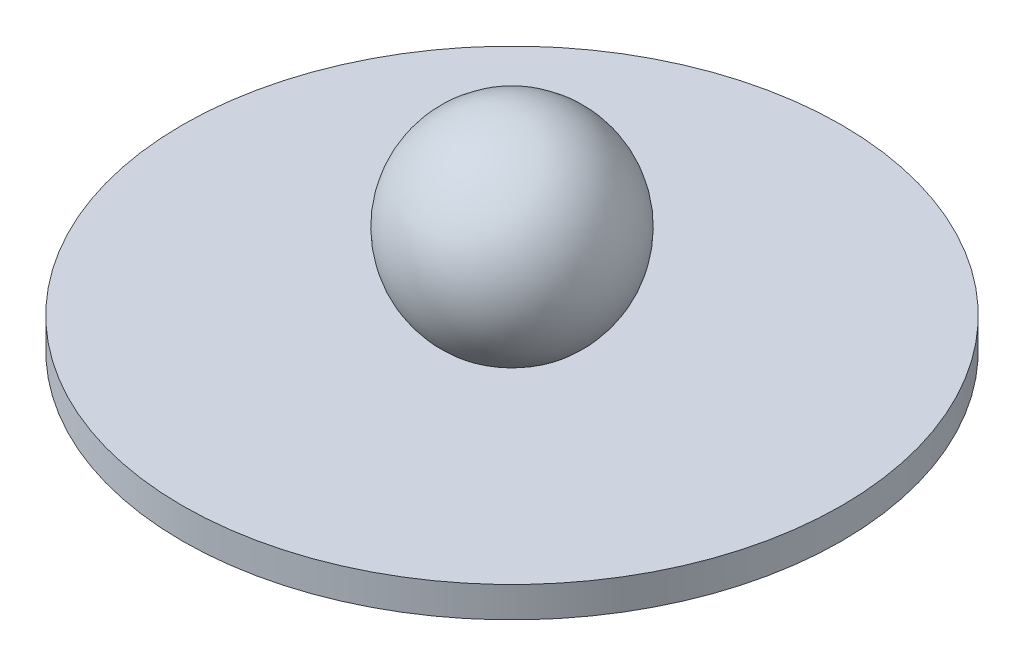
ISO-10303-21;
HEADER;
FILE_DESCRIPTION(('STEP AP214'),'2;1');
FILE_NAME('part.step','',(''),(''),'','','');
FILE_SCHEMA(('AUTOMOTIVE_DESIGN { 1 0 10303 214 1 1 1 1 }'));
ENDSEC;
DATA;
#1=APPLICATION_CONTEXT('core data for automotive mechanical design processes');
#2=APPLICATION_PROTOCOL_DEFINITION('international standard','automotive_design',2000,#1);
#3=PRODUCT_CONTEXT('',#1,'mechanical');
#4=PRODUCT('Part','Part','',(#3));
#5=PRODUCT_RELATED_PRODUCT_CATEGORY('part','',(#4));
#6=PRODUCT_DEFINITION_FORMATION('','',#4);
#7=PRODUCT_DEFINITION_CONTEXT('part definition',#1,'design');
#8=PRODUCT_DEFINITION('design','',#6,#7);
#9=PRODUCT_DEFINITION_SHAPE('','',#8);
#10=(LENGTH_UNIT() NAMED_UNIT(*) SI_UNIT(.MILLI.,.METRE.));
#11=(NAMED_UNIT(*) PLANE_ANGLE_UNIT() SI_UNIT($,.RADIAN.));
#12=(NAMED_UNIT(*) SI_UNIT($,.STERADIAN.) SOLID_ANGLE_UNIT());
#13=UNCERTAINTY_MEASURE_WITH_UNIT(LENGTH_MEASURE(1.E-05),#10,'distance_accuracy_value','');
#14=(GEOMETRIC_REPRESENTATION_CONTEXT(3) GLOBAL_UNCERTAINTY_ASSIGNED_CONTEXT((#13)) GLOBAL_UNIT_ASSIGNED_CONTEXT((#10,
#11,#12)) REPRESENTATION_CONTEXT('',''));
#15=CARTESIAN_POINT('',(0.,0.,0.));
#16=DIRECTION('',(0.,0.,1.));
#17=DIRECTION('',(1.,0.,0.));
#18=AXIS2_PLACEMENT_3D('',#15,#16,#17);
#19=CARTESIAN_POINT('',(0.,12.7,0.));
#20=DIRECTION('',(0.,1.,0.));
#21=DIRECTION('',(0.,0.,1.));
#22=AXIS2_PLACEMENT_3D('',#19,#20,#21);
#23=PLANE('',#22);
#24=CARTESIAN_POINT('',(0.,12.7,0.));
#25=DIRECTION('',(0.,1.,0.));
#26=DIRECTION('',(0.,0.,1.));
#27=AXIS2_PLACEMENT_3D('',#24,#25,#26);
#28=CIRCLE('',#27,12.2794054520389);
#29=CARTESIAN_POINT('',(0.,12.7,12.2794054520389));
#30=VERTEX_POINT('',#29);
#31=EDGE_CURVE('E10',#30,#30,#28,.T.);
#32=ORIENTED_EDGE('',*,*,#31,.F.);
#33=EDGE_LOOP('',(#32));
#34=FACE_BOUND('',#33,.T.);
#35=CARTESIAN_POINT('',(0.,12.7,0.));
#36=DIRECTION('',(0.,-1.,0.));
#37=DIRECTION('',(0.,0.,-1.));
#38=AXIS2_PLACEMENT_3D('',#35,#36,#37);
#39=CIRCLE('',#38,62.865);
#40=CARTESIAN_POINT('',(0.,12.7,-62.865));
#41=VERTEX_POINT('',#40);
#42=EDGE_CURVE('E39',#41,#41,#39,.T.);
#43=ORIENTED_EDGE('',*,*,#42,.F.);
#44=EDGE_LOOP('',(#43));
#45=FACE_BOUND('',#44,.T.);
#46=ADVANCED_FACE('F33',(#34,#45),#23,.T.);
#47=CARTESIAN_POINT('',(0.,0.,0.));
#48=DIRECTION('',(0.,-1.,0.));
#49=DIRECTION('',(0.,0.,-1.));
#50=AXIS2_PLACEMENT_3D('',#47,#48,#49);
#51=CYLINDRICAL_SURFACE('',#50,62.865);
#52=ORIENTED_EDGE('',*,*,#42,.T.);
#53=EDGE_LOOP('',(#52));
#54=FACE_BOUND('',#53,.T.);
#55=CARTESIAN_POINT('',(0.,6.85799999999998,0.));
#56=DIRECTION('',(0.,-1.,0.));
#57=DIRECTION('',(0.,0.,-1.));
#58=AXIS2_PLACEMENT_3D('',#55,#56,#57);
#59=CIRCLE('',#58,62.865);
#60=CARTESIAN_POINT('',(0.,6.85799999999998,-62.865));
#61=VERTEX_POINT('',#60);
#62=EDGE_CURVE('E43',#61,#61,#59,.T.);
#63=ORIENTED_EDGE('',*,*,#62,.F.);
#64=EDGE_LOOP('',(#63));
#65=FACE_BOUND('',#64,.T.);
#66=ADVANCED_FACE('F69',(#54,#65),#51,.T.);
#67=CARTESIAN_POINT('',(62.865,6.85799999999999,0.));
#68=DIRECTION('',(0.,-1.,0.));
#69=DIRECTION('',(0.,0.,-1.));
#70=AXIS2_PLACEMENT_3D('',#67,#68,#69);
#71=PLANE('',#70);
#72=ORIENTED_EDGE('',*,*,#62,.T.);
#73=EDGE_LOOP('',(#72));
#74=FACE_BOUND('',#73,.T.);
#75=CARTESIAN_POINT('',(0.,6.85799999999999,0.));
#76=DIRECTION('',(0.,-1.,0.));
#77=DIRECTION('',(0.,0.,-1.));
#78=AXIS2_PLACEMENT_3D('',#75,#76,#77);
#79=CIRCLE('',#78,57.785);
#80=CARTESIAN_POINT('',(0.,6.85799999999999,-57.785));
#81=VERTEX_POINT('',#80);
#82=EDGE_CURVE('E47',#81,#81,#79,.T.);
#83=ORIENTED_EDGE('',*,*,#82,.F.);
#84=EDGE_LOOP('',(#83));
#85=FACE_BOUND('',#84,.T.);
#86=ADVANCED_FACE('F60',(#74,#85),#71,.T.);
#87=CARTESIAN_POINT('',(0.,0.,0.));
#88=DIRECTION('',(0.,1.,0.));
#89=DIRECTION('',(0.,0.,1.));
#90=AXIS2_PLACEMENT_3D('',#87,#88,#89);
#91=CONICAL_SURFACE('',#90,50.9270000000001,0.785398163397443);
#92=ORIENTED_EDGE('',*,*,#82,.T.);
#93=EDGE_LOOP('',(#92));
#94=FACE_BOUND('',#93,.T.);
#95=CARTESIAN_POINT('',(0.,0.,0.));
#96=DIRECTION('',(0.,-1.,0.));
#97=DIRECTION('',(0.,0.,-1.));
#98=AXIS2_PLACEMENT_3D('',#95,#96,#97);
#99=CIRCLE('',#98,50.9270000000001);
#100=CARTESIAN_POINT('',(0.,0.,-50.9270000000001));
#101=VERTEX_POINT('',#100);
#102=EDGE_CURVE('E52',#101,#101,#99,.T.);
#103=ORIENTED_EDGE('',*,*,#102,.F.);
#104=EDGE_LOOP('',(#103));
#105=FACE_BOUND('',#104,.T.);
#106=ADVANCED_FACE('F58',(#94,#105),#91,.T.);
#107=CARTESIAN_POINT('',(50.9270000000001,0.,0.));
#108=DIRECTION('',(0.,-1.,0.));
#109=DIRECTION('',(0.,0.,-1.));
#110=AXIS2_PLACEMENT_3D('',#107,#108,#109);
#111=PLANE('',#110);
#112=ORIENTED_EDGE('',*,*,#102,.T.);
#113=EDGE_LOOP('',(#112));
#114=FACE_BOUND('',#113,.T.);
#115=ADVANCED_FACE('F56',(#114),#111,.T.);
#116=CARTESIAN_POINT('',(0.,27.264295442775,0.));
#117=DIRECTION('',(0.,-1.,0.));
#118=DIRECTION('',(-1.,0.,0.));
#119=AXIS2_PLACEMENT_3D('',#116,#117,#118);
#120=SPHERICAL_SURFACE('',#119,19.05);
#121=ORIENTED_EDGE('',*,*,#31,.T.);
#122=EDGE_LOOP('',(#121));
#123=FACE_BOUND('',#122,.T.);
#124=ADVANCED_FACE('F67',(#123),#120,.T.);
#125=CLOSED_SHELL('',(#46,#66,#86,#106,#115,#124));
#126=MANIFOLD_SOLID_BREP('B2',#125);
#127=ADVANCED_BREP_SHAPE_REPRESENTATION('',(#18,#126),#14);
#128=SHAPE_DEFINITION_REPRESENTATION(#9,#127);
ENDSEC;
END-ISO-10303-21;
